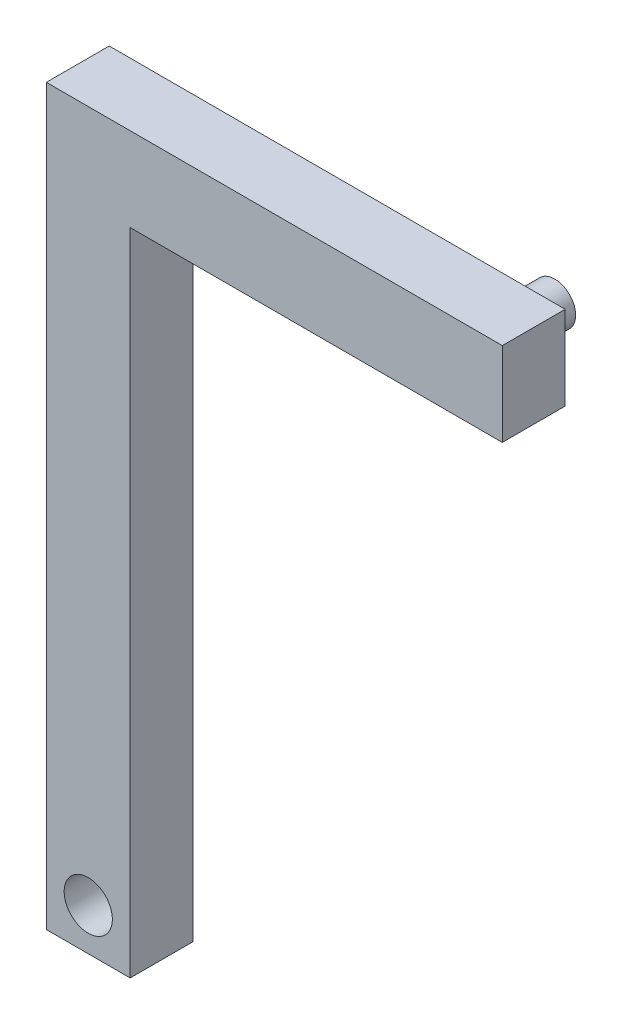
ISO-10303-21;
HEADER;
FILE_DESCRIPTION(('STEP AP214'),'2;1');
FILE_NAME('part.step','',(''),(''),'','','');
FILE_SCHEMA(('AUTOMOTIVE_DESIGN { 1 0 10303 214 1 1 1 1 }'));
ENDSEC;
DATA;
#1=APPLICATION_CONTEXT('core data for automotive mechanical design processes');
#2=APPLICATION_PROTOCOL_DEFINITION('international standard','automotive_design',2000,#1);
#3=PRODUCT_CONTEXT('',#1,'mechanical');
#4=PRODUCT('Part','Part','',(#3));
#5=PRODUCT_RELATED_PRODUCT_CATEGORY('part','',(#4));
#6=PRODUCT_DEFINITION_FORMATION('','',#4);
#7=PRODUCT_DEFINITION_CONTEXT('part definition',#1,'design');
#8=PRODUCT_DEFINITION('design','',#6,#7);
#9=PRODUCT_DEFINITION_SHAPE('','',#8);
#10=(LENGTH_UNIT() NAMED_UNIT(*) SI_UNIT(.MILLI.,.METRE.));
#11=(NAMED_UNIT(*) PLANE_ANGLE_UNIT() SI_UNIT($,.RADIAN.));
#12=(NAMED_UNIT(*) SI_UNIT($,.STERADIAN.) SOLID_ANGLE_UNIT());
#13=UNCERTAINTY_MEASURE_WITH_UNIT(LENGTH_MEASURE(1.E-05),#10,'distance_accuracy_value','');
#14=(GEOMETRIC_REPRESENTATION_CONTEXT(3) GLOBAL_UNCERTAINTY_ASSIGNED_CONTEXT((#13)) GLOBAL_UNIT_ASSIGNED_CONTEXT((#10,
#11,#12)) REPRESENTATION_CONTEXT('',''));
#15=CARTESIAN_POINT('',(0.,0.,0.));
#16=DIRECTION('',(0.,0.,1.));
#17=DIRECTION('',(1.,0.,0.));
#18=AXIS2_PLACEMENT_3D('',#15,#16,#17);
#19=CARTESIAN_POINT('',(0.,-4.,3.));
#20=DIRECTION('',(0.,1.,0.));
#21=DIRECTION('',(0.,0.,1.));
#22=AXIS2_PLACEMENT_3D('',#19,#20,#21);
#23=PLANE('',#22);
#24=DIRECTION('',(1.,0.,0.));
#25=VECTOR('',#24,1.);
#26=CARTESIAN_POINT('',(0.,-4.,3.));
#27=LINE('',#26,#25);
#28=CARTESIAN_POINT('',(4.75,-4.,3.));
#29=VERTEX_POINT('',#28);
#30=CARTESIAN_POINT('',(22.5,-4.,3.));
#31=VERTEX_POINT('',#30);
#32=EDGE_CURVE('E84',#29,#31,#27,.T.);
#33=ORIENTED_EDGE('',*,*,#32,.F.);
#34=DIRECTION('',(0.,0.,-1.));
#35=VECTOR('',#34,1.);
#36=CARTESIAN_POINT('',(4.75,-4.,3.));
#37=LINE('',#36,#35);
#38=CARTESIAN_POINT('',(4.75,-4.,0.));
#39=VERTEX_POINT('',#38);
#40=EDGE_CURVE('E106',#29,#39,#37,.T.);
#41=ORIENTED_EDGE('',*,*,#40,.T.);
#42=DIRECTION('',(1.,0.,0.));
#43=VECTOR('',#42,1.);
#44=CARTESIAN_POINT('',(0.,-4.,0.));
#45=LINE('',#44,#43);
#46=CARTESIAN_POINT('',(22.5,-4.,0.));
#47=VERTEX_POINT('',#46);
#48=EDGE_CURVE('E95',#39,#47,#45,.T.);
#49=ORIENTED_EDGE('',*,*,#48,.T.);
#50=DIRECTION('',(0.,0.,-1.));
#51=VECTOR('',#50,1.);
#52=CARTESIAN_POINT('',(22.5,-4.,3.));
#53=LINE('',#52,#51);
#54=EDGE_CURVE('E43',#31,#47,#53,.T.);
#55=ORIENTED_EDGE('',*,*,#54,.F.);
#56=EDGE_LOOP('',(#33,#41,#49,#55));
#57=FACE_BOUND('',#56,.T.);
#58=ADVANCED_FACE('F36',(#57),#23,.F.);
#59=CARTESIAN_POINT('',(22.5,0.,3.));
#60=DIRECTION('',(1.,0.,0.));
#61=DIRECTION('',(0.,0.,-1.));
#62=AXIS2_PLACEMENT_3D('',#59,#60,#61);
#63=PLANE('',#62);
#64=DIRECTION('',(0.,-1.,0.));
#65=VECTOR('',#64,1.);
#66=CARTESIAN_POINT('',(22.5,0.,0.));
#67=LINE('',#66,#65);
#68=CARTESIAN_POINT('',(22.5,0.,0.));
#69=VERTEX_POINT('',#68);
#70=EDGE_CURVE('E78',#69,#47,#67,.T.);
#71=ORIENTED_EDGE('',*,*,#70,.F.);
#72=DIRECTION('',(0.,0.,-1.));
#73=VECTOR('',#72,1.);
#74=CARTESIAN_POINT('',(22.5,0.,3.));
#75=LINE('',#74,#73);
#76=CARTESIAN_POINT('',(22.5,0.,3.));
#77=VERTEX_POINT('',#76);
#78=EDGE_CURVE('E86',#77,#69,#75,.T.);
#79=ORIENTED_EDGE('',*,*,#78,.F.);
#80=DIRECTION('',(0.,-1.,0.));
#81=VECTOR('',#80,1.);
#82=CARTESIAN_POINT('',(22.5,0.,3.));
#83=LINE('',#82,#81);
#84=EDGE_CURVE('E101',#77,#31,#83,.T.);
#85=ORIENTED_EDGE('',*,*,#84,.T.);
#86=ORIENTED_EDGE('',*,*,#54,.T.);
#87=EDGE_LOOP('',(#71,#79,#85,#86));
#88=FACE_BOUND('',#87,.T.);
#89=ADVANCED_FACE('F93',(#88),#63,.T.);
#90=CARTESIAN_POINT('',(0.,0.,3.));
#91=DIRECTION('',(0.,1.,0.));
#92=DIRECTION('',(0.,0.,1.));
#93=AXIS2_PLACEMENT_3D('',#90,#91,#92);
#94=PLANE('',#93);
#95=DIRECTION('',(0.,0.,-1.));
#96=VECTOR('',#95,1.);
#97=CARTESIAN_POINT('',(0.749999999999998,0.,3.));
#98=LINE('',#97,#96);
#99=CARTESIAN_POINT('',(0.749999999999998,0.,3.));
#100=VERTEX_POINT('',#99);
#101=CARTESIAN_POINT('',(0.749999999999998,0.,0.));
#102=VERTEX_POINT('',#101);
#103=EDGE_CURVE('E119',#100,#102,#98,.T.);
#104=ORIENTED_EDGE('',*,*,#103,.F.);
#105=DIRECTION('',(1.,0.,0.));
#106=VECTOR('',#105,1.);
#107=CARTESIAN_POINT('',(0.,0.,3.));
#108=LINE('',#107,#106);
#109=EDGE_CURVE('E59',#100,#77,#108,.T.);
#110=ORIENTED_EDGE('',*,*,#109,.T.);
#111=ORIENTED_EDGE('',*,*,#78,.T.);
#112=DIRECTION('',(1.,0.,0.));
#113=VECTOR('',#112,1.);
#114=CARTESIAN_POINT('',(0.,0.,0.));
#115=LINE('',#114,#113);
#116=EDGE_CURVE('E74',#102,#69,#115,.T.);
#117=ORIENTED_EDGE('',*,*,#116,.F.);
#118=EDGE_LOOP('',(#104,#110,#111,#117));
#119=FACE_BOUND('',#118,.T.);
#120=ADVANCED_FACE('F87',(#119),#94,.T.);
#121=CARTESIAN_POINT('',(0.,0.,3.));
#122=DIRECTION('',(0.,0.,1.));
#123=DIRECTION('',(1.,0.,0.));
#124=AXIS2_PLACEMENT_3D('',#121,#122,#123);
#125=PLANE('',#124);
#126=CARTESIAN_POINT('',(2.75,-33.,3.));
#127=DIRECTION('',(0.,0.,-1.));
#128=DIRECTION('',(-1.,0.,0.));
#129=AXIS2_PLACEMENT_3D('',#126,#127,#128);
#130=CIRCLE('',#129,1.15);
#131=CARTESIAN_POINT('',(1.6,-33.,3.));
#132=VERTEX_POINT('',#131);
#133=EDGE_CURVE('E128',#132,#132,#130,.T.);
#134=ORIENTED_EDGE('',*,*,#133,.T.);
#135=EDGE_LOOP('',(#134));
#136=FACE_BOUND('',#135,.T.);
#137=ORIENTED_EDGE('',*,*,#109,.F.);
#138=DIRECTION('',(0.,1.,0.));
#139=VECTOR('',#138,1.);
#140=CARTESIAN_POINT('',(0.749999999999998,-4.,3.));
#141=LINE('',#140,#139);
#142=CARTESIAN_POINT('',(0.749999999999995,-35.,3.));
#143=VERTEX_POINT('',#142);
#144=EDGE_CURVE('E110',#143,#100,#141,.T.);
#145=ORIENTED_EDGE('',*,*,#144,.F.);
#146=DIRECTION('',(-1.,0.,0.));
#147=VECTOR('',#146,1.);
#148=CARTESIAN_POINT('',(4.74999999999999,-35.,3.));
#149=LINE('',#148,#147);
#150=CARTESIAN_POINT('',(4.74999999999999,-35.,3.));
#151=VERTEX_POINT('',#150);
#152=EDGE_CURVE('E122',#151,#143,#149,.T.);
#153=ORIENTED_EDGE('',*,*,#152,.F.);
#154=DIRECTION('',(0.,-1.,0.));
#155=VECTOR('',#154,1.);
#156=CARTESIAN_POINT('',(4.75,-4.,3.));
#157=LINE('',#156,#155);
#158=EDGE_CURVE('E115',#29,#151,#157,.T.);
#159=ORIENTED_EDGE('',*,*,#158,.F.);
#160=ORIENTED_EDGE('',*,*,#32,.T.);
#161=ORIENTED_EDGE('',*,*,#84,.F.);
#162=EDGE_LOOP('',(#137,#145,#153,#159,#160,#161));
#163=FACE_BOUND('',#162,.T.);
#164=ADVANCED_FACE('F135',(#136,#163),#125,.T.);
#165=CARTESIAN_POINT('',(0.,0.,0.));
#166=DIRECTION('',(0.,0.,1.));
#167=DIRECTION('',(1.,0.,0.));
#168=AXIS2_PLACEMENT_3D('',#165,#166,#167);
#169=PLANE('',#168);
#170=CARTESIAN_POINT('',(2.75,-33.,0.));
#171=DIRECTION('',(0.,0.,-1.));
#172=DIRECTION('',(-1.,0.,0.));
#173=AXIS2_PLACEMENT_3D('',#170,#171,#172);
#174=CIRCLE('',#173,1.15);
#175=CARTESIAN_POINT('',(1.6,-33.,0.));
#176=VERTEX_POINT('',#175);
#177=EDGE_CURVE('E129',#176,#176,#174,.T.);
#178=ORIENTED_EDGE('',*,*,#177,.F.);
#179=EDGE_LOOP('',(#178));
#180=FACE_BOUND('',#179,.T.);
#181=CARTESIAN_POINT('',(20.,-2.,0.));
#182=DIRECTION('',(0.,0.,1.));
#183=DIRECTION('',(1.,0.,0.));
#184=AXIS2_PLACEMENT_3D('',#181,#182,#183);
#185=CIRCLE('',#184,1.);
#186=CARTESIAN_POINT('',(21.,-2.,0.));
#187=VERTEX_POINT('',#186);
#188=EDGE_CURVE('E11',#187,#187,#185,.F.);
#189=ORIENTED_EDGE('',*,*,#188,.F.);
#190=EDGE_LOOP('',(#189));
#191=FACE_BOUND('',#190,.T.);
#192=DIRECTION('',(0.,1.,0.));
#193=VECTOR('',#192,1.);
#194=CARTESIAN_POINT('',(0.749999999999998,-4.,0.));
#195=LINE('',#194,#193);
#196=CARTESIAN_POINT('',(0.749999999999995,-35.,0.));
#197=VERTEX_POINT('',#196);
#198=EDGE_CURVE('E82',#197,#102,#195,.T.);
#199=ORIENTED_EDGE('',*,*,#198,.T.);
#200=ORIENTED_EDGE('',*,*,#116,.T.);
#201=ORIENTED_EDGE('',*,*,#70,.T.);
#202=ORIENTED_EDGE('',*,*,#48,.F.);
#203=DIRECTION('',(0.,-1.,0.));
#204=VECTOR('',#203,1.);
#205=CARTESIAN_POINT('',(4.75,-4.,0.));
#206=LINE('',#205,#204);
#207=CARTESIAN_POINT('',(4.74999999999999,-35.,0.));
#208=VERTEX_POINT('',#207);
#209=EDGE_CURVE('E50',#39,#208,#206,.T.);
#210=ORIENTED_EDGE('',*,*,#209,.T.);
#211=DIRECTION('',(-1.,0.,0.));
#212=VECTOR('',#211,1.);
#213=CARTESIAN_POINT('',(4.74999999999999,-35.,0.));
#214=LINE('',#213,#212);
#215=EDGE_CURVE('E116',#208,#197,#214,.T.);
#216=ORIENTED_EDGE('',*,*,#215,.T.);
#217=EDGE_LOOP('',(#199,#200,#201,#202,#210,#216));
#218=FACE_BOUND('',#217,.T.);
#219=ADVANCED_FACE('F75',(#180,#191,#218),#169,.F.);
#220=CARTESIAN_POINT('',(20.,-2.,-2.));
#221=DIRECTION('',(0.,0.,1.));
#222=DIRECTION('',(1.,0.,0.));
#223=AXIS2_PLACEMENT_3D('',#220,#221,#222);
#224=CYLINDRICAL_SURFACE('',#223,1.);
#225=CARTESIAN_POINT('',(20.,-2.,-2.));
#226=DIRECTION('',(0.,0.,-1.));
#227=DIRECTION('',(-1.,0.,0.));
#228=AXIS2_PLACEMENT_3D('',#225,#226,#227);
#229=CIRCLE('',#228,1.);
#230=CARTESIAN_POINT('',(19.,-2.,-2.));
#231=VERTEX_POINT('',#230);
#232=EDGE_CURVE('E97',#231,#231,#229,.T.);
#233=ORIENTED_EDGE('',*,*,#232,.F.);
#234=EDGE_LOOP('',(#233));
#235=FACE_BOUND('',#234,.T.);
#236=ORIENTED_EDGE('',*,*,#188,.T.);
#237=EDGE_LOOP('',(#236));
#238=FACE_BOUND('',#237,.T.);
#239=ADVANCED_FACE('F147',(#235,#238),#224,.T.);
#240=CARTESIAN_POINT('',(20.,-2.,-2.));
#241=DIRECTION('',(0.,0.,-1.));
#242=DIRECTION('',(-1.,0.,0.));
#243=AXIS2_PLACEMENT_3D('',#240,#241,#242);
#244=PLANE('',#243);
#245=ORIENTED_EDGE('',*,*,#232,.T.);
#246=EDGE_LOOP('',(#245));
#247=FACE_BOUND('',#246,.T.);
#248=ADVANCED_FACE('F152',(#247),#244,.T.);
#249=CARTESIAN_POINT('',(4.75,-4.,3.));
#250=DIRECTION('',(1.,0.,0.));
#251=DIRECTION('',(0.,1.,0.));
#252=AXIS2_PLACEMENT_3D('',#249,#250,#251);
#253=PLANE('',#252);
#254=ORIENTED_EDGE('',*,*,#209,.F.);
#255=ORIENTED_EDGE('',*,*,#40,.F.);
#256=ORIENTED_EDGE('',*,*,#158,.T.);
#257=DIRECTION('',(0.,0.,-1.));
#258=VECTOR('',#257,1.);
#259=CARTESIAN_POINT('',(4.74999999999999,-35.,3.));
#260=LINE('',#259,#258);
#261=EDGE_CURVE('E107',#151,#208,#260,.T.);
#262=ORIENTED_EDGE('',*,*,#261,.T.);
#263=EDGE_LOOP('',(#254,#255,#256,#262));
#264=FACE_BOUND('',#263,.T.);
#265=ADVANCED_FACE('F158',(#264),#253,.T.);
#266=CARTESIAN_POINT('',(0.749999999999998,-4.,3.));
#267=DIRECTION('',(-1.,0.,0.));
#268=DIRECTION('',(0.,-1.,0.));
#269=AXIS2_PLACEMENT_3D('',#266,#267,#268);
#270=PLANE('',#269);
#271=ORIENTED_EDGE('',*,*,#198,.F.);
#272=DIRECTION('',(0.,0.,-1.));
#273=VECTOR('',#272,1.);
#274=CARTESIAN_POINT('',(0.749999999999995,-35.,3.));
#275=LINE('',#274,#273);
#276=EDGE_CURVE('E109',#143,#197,#275,.T.);
#277=ORIENTED_EDGE('',*,*,#276,.F.);
#278=ORIENTED_EDGE('',*,*,#144,.T.);
#279=ORIENTED_EDGE('',*,*,#103,.T.);
#280=EDGE_LOOP('',(#271,#277,#278,#279));
#281=FACE_BOUND('',#280,.T.);
#282=ADVANCED_FACE('F188',(#281),#270,.T.);
#283=CARTESIAN_POINT('',(4.74999999999999,-35.,3.));
#284=DIRECTION('',(0.,-1.,0.));
#285=DIRECTION('',(0.,0.,-1.));
#286=AXIS2_PLACEMENT_3D('',#283,#284,#285);
#287=PLANE('',#286);
#288=ORIENTED_EDGE('',*,*,#215,.F.);
#289=ORIENTED_EDGE('',*,*,#261,.F.);
#290=ORIENTED_EDGE('',*,*,#152,.T.);
#291=ORIENTED_EDGE('',*,*,#276,.T.);
#292=EDGE_LOOP('',(#288,#289,#290,#291));
#293=FACE_BOUND('',#292,.T.);
#294=ADVANCED_FACE('F141',(#293),#287,.T.);
#295=CARTESIAN_POINT('',(2.75,-33.,3.));
#296=DIRECTION('',(0.,0.,-1.));
#297=DIRECTION('',(-1.,0.,0.));
#298=AXIS2_PLACEMENT_3D('',#295,#296,#297);
#299=CYLINDRICAL_SURFACE('',#298,1.15);
#300=ORIENTED_EDGE('',*,*,#133,.F.);
#301=EDGE_LOOP('',(#300));
#302=FACE_BOUND('',#301,.T.);
#303=ORIENTED_EDGE('',*,*,#177,.T.);
#304=EDGE_LOOP('',(#303));
#305=FACE_BOUND('',#304,.T.);
#306=ADVANCED_FACE('F138',(#302,#305),#299,.F.);
#307=CLOSED_SHELL('',(#58,#89,#120,#164,#219,#239,#248,#265,#282,#294,#306));
#308=MANIFOLD_SOLID_BREP('B2',#307);
#309=ADVANCED_BREP_SHAPE_REPRESENTATION('',(#18,#308),#14);
#310=SHAPE_DEFINITION_REPRESENTATION(#9,#309);
ENDSEC;
END-ISO-10303-21;
